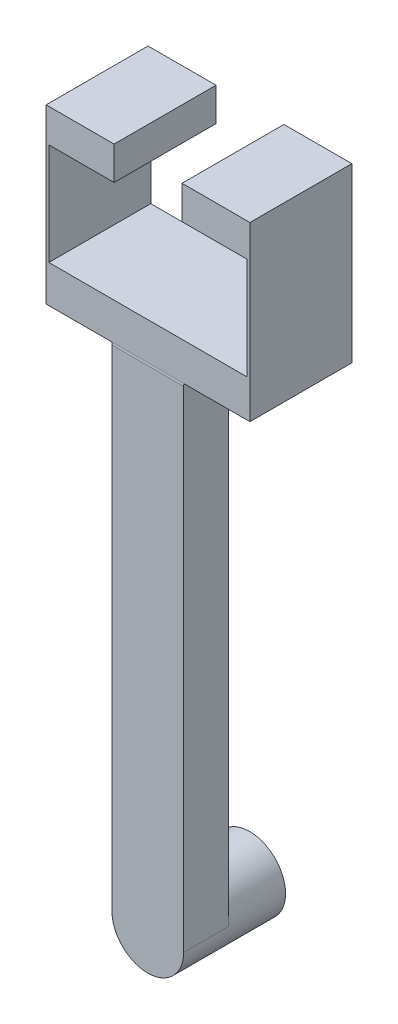
ISO-10303-21;
HEADER;
FILE_DESCRIPTION(('STEP AP214'),'2;1');
FILE_NAME('part.step','',(''),(''),'','','');
FILE_SCHEMA(('AUTOMOTIVE_DESIGN { 1 0 10303 214 1 1 1 1 }'));
ENDSEC;
DATA;
#1=APPLICATION_CONTEXT('core data for automotive mechanical design processes');
#2=APPLICATION_PROTOCOL_DEFINITION('international standard','automotive_design',2000,#1);
#3=PRODUCT_CONTEXT('',#1,'mechanical');
#4=PRODUCT('Part','Part','',(#3));
#5=PRODUCT_RELATED_PRODUCT_CATEGORY('part','',(#4));
#6=PRODUCT_DEFINITION_FORMATION('','',#4);
#7=PRODUCT_DEFINITION_CONTEXT('part definition',#1,'design');
#8=PRODUCT_DEFINITION('design','',#6,#7);
#9=PRODUCT_DEFINITION_SHAPE('','',#8);
#10=(LENGTH_UNIT() NAMED_UNIT(*) SI_UNIT(.MILLI.,.METRE.));
#11=(NAMED_UNIT(*) PLANE_ANGLE_UNIT() SI_UNIT($,.RADIAN.));
#12=(NAMED_UNIT(*) SI_UNIT($,.STERADIAN.) SOLID_ANGLE_UNIT());
#13=UNCERTAINTY_MEASURE_WITH_UNIT(LENGTH_MEASURE(1.E-05),#10,'distance_accuracy_value','');
#14=(GEOMETRIC_REPRESENTATION_CONTEXT(3) GLOBAL_UNCERTAINTY_ASSIGNED_CONTEXT((#13)) GLOBAL_UNIT_ASSIGNED_CONTEXT((#10,
#11,#12)) REPRESENTATION_CONTEXT('',''));
#15=CARTESIAN_POINT('',(0.,0.,0.));
#16=DIRECTION('',(0.,0.,1.));
#17=DIRECTION('',(1.,0.,0.));
#18=AXIS2_PLACEMENT_3D('',#15,#16,#17);
#19=CARTESIAN_POINT('',(0.,0.,38.1));
#20=DIRECTION('',(0.,0.,-1.));
#21=DIRECTION('',(-1.,0.,0.));
#22=AXIS2_PLACEMENT_3D('',#19,#20,#21);
#23=CYLINDRICAL_SURFACE('',#22,13.4112);
#24=CARTESIAN_POINT('',(0.,0.,38.1));
#25=DIRECTION('',(0.,0.,1.));
#26=DIRECTION('',(1.,0.,0.));
#27=AXIS2_PLACEMENT_3D('',#24,#25,#26);
#28=CIRCLE('',#27,13.4112);
#29=CARTESIAN_POINT('',(-13.4112,0.,38.1));
#30=VERTEX_POINT('',#29);
#31=CARTESIAN_POINT('',(13.4112,0.,38.1));
#32=VERTEX_POINT('',#31);
#33=EDGE_CURVE('E546',#30,#32,#28,.T.);
#34=ORIENTED_EDGE('',*,*,#33,.F.);
#35=DIRECTION('',(0.,0.,1.));
#36=VECTOR('',#35,1.);
#37=CARTESIAN_POINT('',(-13.4112,0.,21.3614));
#38=LINE('',#37,#36);
#39=CARTESIAN_POINT('',(-13.4112,0.,21.3614));
#40=VERTEX_POINT('',#39);
#41=EDGE_CURVE('E545',#40,#30,#38,.T.);
#42=ORIENTED_EDGE('',*,*,#41,.F.);
#43=CARTESIAN_POINT('',(0.,0.,21.3614));
#44=DIRECTION('',(0.,0.,-1.));
#45=DIRECTION('',(-1.,0.,0.));
#46=AXIS2_PLACEMENT_3D('',#43,#44,#45);
#47=CIRCLE('',#46,13.4112);
#48=CARTESIAN_POINT('',(13.4112,0.,21.3614));
#49=VERTEX_POINT('',#48);
#50=EDGE_CURVE('E549',#40,#49,#47,.T.);
#51=ORIENTED_EDGE('',*,*,#50,.T.);
#52=DIRECTION('',(0.,0.,1.));
#53=VECTOR('',#52,1.);
#54=CARTESIAN_POINT('',(13.4112,0.,21.3614));
#55=LINE('',#54,#53);
#56=EDGE_CURVE('E538',#49,#32,#55,.T.);
#57=ORIENTED_EDGE('',*,*,#56,.T.);
#58=EDGE_LOOP('',(#34,#42,#51,#57));
#59=FACE_BOUND('',#58,.T.);
#60=CARTESIAN_POINT('',(0.,0.,0.));
#61=DIRECTION('',(0.,0.,1.));
#62=DIRECTION('',(1.,0.,0.));
#63=AXIS2_PLACEMENT_3D('',#60,#61,#62);
#64=CIRCLE('',#63,13.4112);
#65=CARTESIAN_POINT('',(13.4112,0.,0.));
#66=VERTEX_POINT('',#65);
#67=EDGE_CURVE('E534',#66,#66,#64,.T.);
#68=ORIENTED_EDGE('',*,*,#67,.T.);
#69=EDGE_LOOP('',(#68));
#70=FACE_BOUND('',#69,.T.);
#71=ADVANCED_FACE('F254',(#59,#70),#23,.T.);
#72=CARTESIAN_POINT('',(0.,0.,38.1));
#73=DIRECTION('',(0.,0.,1.));
#74=DIRECTION('',(1.,0.,0.));
#75=AXIS2_PLACEMENT_3D('',#72,#73,#74);
#76=PLANE('',#75);
#77=DIRECTION('',(0.,1.,0.));
#78=VECTOR('',#77,1.);
#79=CARTESIAN_POINT('',(13.4112,0.,38.1));
#80=LINE('',#79,#78);
#81=CARTESIAN_POINT('',(13.4112,183.275219138852,38.1));
#82=VERTEX_POINT('',#81);
#83=EDGE_CURVE('E519',#32,#82,#80,.T.);
#84=ORIENTED_EDGE('',*,*,#83,.T.);
#85=DIRECTION('',(1.,0.,0.));
#86=VECTOR('',#85,1.);
#87=CARTESIAN_POINT('',(-13.4112,183.275219138852,38.1));
#88=LINE('',#87,#86);
#89=CARTESIAN_POINT('',(-13.4112,183.275219138852,38.1));
#90=VERTEX_POINT('',#89);
#91=EDGE_CURVE('E557',#82,#90,#88,.F.);
#92=ORIENTED_EDGE('',*,*,#91,.T.);
#93=DIRECTION('',(0.,-1.,0.));
#94=VECTOR('',#93,1.);
#95=CARTESIAN_POINT('',(-13.4112,0.,38.1));
#96=LINE('',#95,#94);
#97=EDGE_CURVE('E515',#90,#30,#96,.T.);
#98=ORIENTED_EDGE('',*,*,#97,.T.);
#99=ORIENTED_EDGE('',*,*,#33,.T.);
#100=EDGE_LOOP('',(#84,#92,#98,#99));
#101=FACE_BOUND('',#100,.T.);
#102=ADVANCED_FACE('F719',(#101),#76,.T.);
#103=CARTESIAN_POINT('',(0.,0.,0.));
#104=DIRECTION('',(0.,0.,1.));
#105=DIRECTION('',(1.,0.,0.));
#106=AXIS2_PLACEMENT_3D('',#103,#104,#105);
#107=PLANE('',#106);
#108=ORIENTED_EDGE('',*,*,#67,.F.);
#109=EDGE_LOOP('',(#108));
#110=FACE_BOUND('',#109,.T.);
#111=ADVANCED_FACE('F724',(#110),#107,.F.);
#112=CARTESIAN_POINT('',(-13.4112,0.,21.3614));
#113=DIRECTION('',(-1.,0.,0.));
#114=DIRECTION('',(0.,0.,1.));
#115=AXIS2_PLACEMENT_3D('',#112,#113,#114);
#116=PLANE('',#115);
#117=ORIENTED_EDGE('',*,*,#97,.F.);
#118=CARTESIAN_POINT('',(-13.4112,183.275219138852,34.29));
#119=DIRECTION('',(-1.,0.,0.));
#120=DIRECTION('',(0.,0.,1.));
#121=AXIS2_PLACEMENT_3D('',#118,#119,#120);
#122=CIRCLE('',#121,3.81);
#123=CARTESIAN_POINT('',(-13.4112,184.15,37.9982149944373));
#124=VERTEX_POINT('',#123);
#125=EDGE_CURVE('E262',#90,#124,#122,.T.);
#126=ORIENTED_EDGE('',*,*,#125,.T.);
#127=DIRECTION('',(0.,0.,1.));
#128=VECTOR('',#127,1.);
#129=CARTESIAN_POINT('',(-13.4112,184.15,21.3614));
#130=LINE('',#129,#128);
#131=CARTESIAN_POINT('',(-13.4112,184.15,21.3614));
#132=VERTEX_POINT('',#131);
#133=EDGE_CURVE('E530',#132,#124,#130,.T.);
#134=ORIENTED_EDGE('',*,*,#133,.F.);
#135=DIRECTION('',(0.,-1.,0.));
#136=VECTOR('',#135,1.);
#137=CARTESIAN_POINT('',(-13.4112,0.,21.3614));
#138=LINE('',#137,#136);
#139=EDGE_CURVE('E511',#132,#40,#138,.T.);
#140=ORIENTED_EDGE('',*,*,#139,.T.);
#141=ORIENTED_EDGE('',*,*,#41,.T.);
#142=EDGE_LOOP('',(#117,#126,#134,#140,#141));
#143=FACE_BOUND('',#142,.T.);
#144=ADVANCED_FACE('F565',(#143),#116,.T.);
#145=CARTESIAN_POINT('',(13.4112,0.,21.3614));
#146=DIRECTION('',(1.,0.,0.));
#147=DIRECTION('',(0.,0.,-1.));
#148=AXIS2_PLACEMENT_3D('',#145,#146,#147);
#149=PLANE('',#148);
#150=DIRECTION('',(0.,0.,1.));
#151=VECTOR('',#150,1.);
#152=CARTESIAN_POINT('',(13.4112,184.15,21.3614));
#153=LINE('',#152,#151);
#154=CARTESIAN_POINT('',(13.4112,184.15,21.3614));
#155=VERTEX_POINT('',#154);
#156=CARTESIAN_POINT('',(13.4112,184.15,37.9982149944373));
#157=VERTEX_POINT('',#156);
#158=EDGE_CURVE('E532',#155,#157,#153,.T.);
#159=ORIENTED_EDGE('',*,*,#158,.T.);
#160=CARTESIAN_POINT('',(13.4112,183.275219138852,34.29));
#161=DIRECTION('',(1.,0.,0.));
#162=DIRECTION('',(0.,0.,-1.));
#163=AXIS2_PLACEMENT_3D('',#160,#161,#162);
#164=CIRCLE('',#163,3.81);
#165=EDGE_CURVE('E13',#157,#82,#164,.T.);
#166=ORIENTED_EDGE('',*,*,#165,.T.);
#167=ORIENTED_EDGE('',*,*,#83,.F.);
#168=ORIENTED_EDGE('',*,*,#56,.F.);
#169=DIRECTION('',(0.,1.,0.));
#170=VECTOR('',#169,1.);
#171=CARTESIAN_POINT('',(13.4112,0.,21.3614));
#172=LINE('',#171,#170);
#173=EDGE_CURVE('E517',#49,#155,#172,.T.);
#174=ORIENTED_EDGE('',*,*,#173,.T.);
#175=EDGE_LOOP('',(#159,#166,#167,#168,#174));
#176=FACE_BOUND('',#175,.T.);
#177=ADVANCED_FACE('F734',(#176),#149,.T.);
#178=CARTESIAN_POINT('',(0.,0.,21.3614));
#179=DIRECTION('',(0.,0.,-1.));
#180=DIRECTION('',(-1.,0.,0.));
#181=AXIS2_PLACEMENT_3D('',#178,#179,#180);
#182=PLANE('',#181);
#183=ORIENTED_EDGE('',*,*,#50,.F.);
#184=ORIENTED_EDGE('',*,*,#139,.F.);
#185=DIRECTION('',(-1.,0.,0.));
#186=VECTOR('',#185,1.);
#187=CARTESIAN_POINT('',(-13.4112,184.15,21.3614));
#188=LINE('',#187,#186);
#189=EDGE_CURVE('E525',#155,#132,#188,.T.);
#190=ORIENTED_EDGE('',*,*,#189,.F.);
#191=ORIENTED_EDGE('',*,*,#173,.F.);
#192=EDGE_LOOP('',(#183,#184,#190,#191));
#193=FACE_BOUND('',#192,.T.);
#194=ADVANCED_FACE('F737',(#193),#182,.T.);
#195=CARTESIAN_POINT('',(38.1,198.12,-0.101785005562682));
#196=DIRECTION('',(-1.,0.,0.));
#197=DIRECTION('',(0.,0.,1.));
#198=AXIS2_PLACEMENT_3D('',#195,#196,#197);
#199=PLANE('',#198);
#200=DIRECTION('',(0.,0.,-1.));
#201=VECTOR('',#200,1.);
#202=CARTESIAN_POINT('',(38.1,184.15,-0.101785005562682));
#203=LINE('',#202,#201);
#204=CARTESIAN_POINT('',(38.1,184.15,37.9982149944373));
#205=VERTEX_POINT('',#204);
#206=CARTESIAN_POINT('',(38.1,184.15,-0.101785005562682));
#207=VERTEX_POINT('',#206);
#208=EDGE_CURVE('E470',#205,#207,#203,.T.);
#209=ORIENTED_EDGE('',*,*,#208,.T.);
#210=DIRECTION('',(0.,-1.,0.));
#211=VECTOR('',#210,1.);
#212=CARTESIAN_POINT('',(38.1,198.12,-0.101785005562682));
#213=LINE('',#212,#211);
#214=CARTESIAN_POINT('',(38.1,248.666,-0.101785005562682));
#215=VERTEX_POINT('',#214);
#216=EDGE_CURVE('E506',#215,#207,#213,.T.);
#217=ORIENTED_EDGE('',*,*,#216,.F.);
#218=DIRECTION('',(0.,0.,-1.));
#219=VECTOR('',#218,1.);
#220=CARTESIAN_POINT('',(38.1,248.666,-0.101785005562682));
#221=LINE('',#220,#219);
#222=CARTESIAN_POINT('',(38.1,248.666,37.9982149944373));
#223=VERTEX_POINT('',#222);
#224=EDGE_CURVE('E446',#223,#215,#221,.T.);
#225=ORIENTED_EDGE('',*,*,#224,.F.);
#226=DIRECTION('',(0.,-1.,0.));
#227=VECTOR('',#226,1.);
#228=CARTESIAN_POINT('',(38.1,198.12,37.9982149944373));
#229=LINE('',#228,#227);
#230=EDGE_CURVE('E387',#223,#205,#229,.T.);
#231=ORIENTED_EDGE('',*,*,#230,.T.);
#232=EDGE_LOOP('',(#209,#217,#225,#231));
#233=FACE_BOUND('',#232,.T.);
#234=ADVANCED_FACE('F579',(#233),#199,.F.);
#235=CARTESIAN_POINT('',(-38.1,198.12,-0.101785005562682));
#236=DIRECTION('',(0.,0.,1.));
#237=DIRECTION('',(1.,0.,0.));
#238=AXIS2_PLACEMENT_3D('',#235,#236,#237);
#239=PLANE('',#238);
#240=DIRECTION('',(-1.,0.,0.));
#241=VECTOR('',#240,1.);
#242=CARTESIAN_POINT('',(-38.1,184.15,-0.101785005562682));
#243=LINE('',#242,#241);
#244=CARTESIAN_POINT('',(-38.1,184.15,-0.101785005562682));
#245=VERTEX_POINT('',#244);
#246=EDGE_CURVE('E492',#207,#245,#243,.T.);
#247=ORIENTED_EDGE('',*,*,#246,.T.);
#248=DIRECTION('',(0.,-1.,0.));
#249=VECTOR('',#248,1.);
#250=CARTESIAN_POINT('',(-38.1,198.12,-0.101785005562682));
#251=LINE('',#250,#249);
#252=CARTESIAN_POINT('',(-38.1,248.666,-0.101785005562682));
#253=VERTEX_POINT('',#252);
#254=EDGE_CURVE('E384',#253,#245,#251,.T.);
#255=ORIENTED_EDGE('',*,*,#254,.F.);
#256=DIRECTION('',(-1.,0.,0.));
#257=VECTOR('',#256,1.);
#258=CARTESIAN_POINT('',(-38.1,248.666,-0.101785005562682));
#259=LINE('',#258,#257);
#260=CARTESIAN_POINT('',(-12.7,248.666,-0.101785005562682));
#261=VERTEX_POINT('',#260);
#262=EDGE_CURVE('E402',#261,#253,#259,.T.);
#263=ORIENTED_EDGE('',*,*,#262,.F.);
#264=DIRECTION('',(0.,-1.,0.));
#265=VECTOR('',#264,1.);
#266=CARTESIAN_POINT('',(-12.7,248.666,-0.101785005562682));
#267=LINE('',#266,#265);
#268=CARTESIAN_POINT('',(-12.7,236.22,-0.101785005562682));
#269=VERTEX_POINT('',#268);
#270=EDGE_CURVE('E664',#261,#269,#267,.T.);
#271=ORIENTED_EDGE('',*,*,#270,.T.);
#272=DIRECTION('',(-1.,0.,0.));
#273=VECTOR('',#272,1.);
#274=CARTESIAN_POINT('',(-38.1,236.22,-0.101785005562682));
#275=LINE('',#274,#273);
#276=CARTESIAN_POINT('',(-37.084,236.22,-0.101785005562682));
#277=VERTEX_POINT('',#276);
#278=EDGE_CURVE('E401',#269,#277,#275,.T.);
#279=ORIENTED_EDGE('',*,*,#278,.T.);
#280=DIRECTION('',(0.,-1.,0.));
#281=VECTOR('',#280,1.);
#282=CARTESIAN_POINT('',(-37.084,236.22,-0.101785005562682));
#283=LINE('',#282,#281);
#284=CARTESIAN_POINT('',(-37.084,198.12,-0.101785005562682));
#285=VERTEX_POINT('',#284);
#286=EDGE_CURVE('E454',#277,#285,#283,.T.);
#287=ORIENTED_EDGE('',*,*,#286,.T.);
#288=DIRECTION('',(-1.,0.,0.));
#289=VECTOR('',#288,1.);
#290=CARTESIAN_POINT('',(-38.1,198.12,-0.101785005562682));
#291=LINE('',#290,#289);
#292=CARTESIAN_POINT('',(37.084,198.12,-0.101785005562682));
#293=VERTEX_POINT('',#292);
#294=EDGE_CURVE('E483',#293,#285,#291,.T.);
#295=ORIENTED_EDGE('',*,*,#294,.F.);
#296=DIRECTION('',(0.,-1.,0.));
#297=VECTOR('',#296,1.);
#298=CARTESIAN_POINT('',(37.084,236.22,-0.101785005562682));
#299=LINE('',#298,#297);
#300=CARTESIAN_POINT('',(37.084,236.22,-0.101785005562682));
#301=VERTEX_POINT('',#300);
#302=EDGE_CURVE('E466',#301,#293,#299,.T.);
#303=ORIENTED_EDGE('',*,*,#302,.F.);
#304=DIRECTION('',(-1.,0.,0.));
#305=VECTOR('',#304,1.);
#306=CARTESIAN_POINT('',(38.1,236.22,-0.101785005562682));
#307=LINE('',#306,#305);
#308=CARTESIAN_POINT('',(12.7,236.22,-0.101785005562679));
#309=VERTEX_POINT('',#308);
#310=EDGE_CURVE('E428',#301,#309,#307,.T.);
#311=ORIENTED_EDGE('',*,*,#310,.T.);
#312=DIRECTION('',(0.,-1.,0.));
#313=VECTOR('',#312,1.);
#314=CARTESIAN_POINT('',(12.7,248.666,-0.101785005562679));
#315=LINE('',#314,#313);
#316=CARTESIAN_POINT('',(12.7,248.666,-0.101785005562679));
#317=VERTEX_POINT('',#316);
#318=EDGE_CURVE('E584',#317,#309,#315,.T.);
#319=ORIENTED_EDGE('',*,*,#318,.F.);
#320=DIRECTION('',(-1.,0.,0.));
#321=VECTOR('',#320,1.);
#322=CARTESIAN_POINT('',(38.1,248.666,-0.101785005562682));
#323=LINE('',#322,#321);
#324=EDGE_CURVE('E444',#215,#317,#323,.T.);
#325=ORIENTED_EDGE('',*,*,#324,.F.);
#326=ORIENTED_EDGE('',*,*,#216,.T.);
#327=EDGE_LOOP('',(#247,#255,#263,#271,#279,#287,#295,#303,#311,#319,#325,#326));
#328=FACE_BOUND('',#327,.T.);
#329=ADVANCED_FACE('F582',(#328),#239,.F.);
#330=CARTESIAN_POINT('',(-38.1,198.12,-0.101785005562682));
#331=DIRECTION('',(1.,0.,0.));
#332=DIRECTION('',(0.,0.,-1.));
#333=AXIS2_PLACEMENT_3D('',#330,#331,#332);
#334=PLANE('',#333);
#335=DIRECTION('',(0.,0.,1.));
#336=VECTOR('',#335,1.);
#337=CARTESIAN_POINT('',(-38.1,184.15,-0.101785005562682));
#338=LINE('',#337,#336);
#339=CARTESIAN_POINT('',(-38.1,184.15,37.9982149944373));
#340=VERTEX_POINT('',#339);
#341=EDGE_CURVE('E379',#245,#340,#338,.T.);
#342=ORIENTED_EDGE('',*,*,#341,.T.);
#343=DIRECTION('',(0.,-1.,0.));
#344=VECTOR('',#343,1.);
#345=CARTESIAN_POINT('',(-38.1,198.12,37.9982149944373));
#346=LINE('',#345,#344);
#347=CARTESIAN_POINT('',(-38.1,248.666,37.9982149944373));
#348=VERTEX_POINT('',#347);
#349=EDGE_CURVE('E373',#348,#340,#346,.T.);
#350=ORIENTED_EDGE('',*,*,#349,.F.);
#351=DIRECTION('',(0.,0.,1.));
#352=VECTOR('',#351,1.);
#353=CARTESIAN_POINT('',(-38.1,248.666,-0.101785005562682));
#354=LINE('',#353,#352);
#355=EDGE_CURVE('E378',#253,#348,#354,.T.);
#356=ORIENTED_EDGE('',*,*,#355,.F.);
#357=ORIENTED_EDGE('',*,*,#254,.T.);
#358=EDGE_LOOP('',(#342,#350,#356,#357));
#359=FACE_BOUND('',#358,.T.);
#360=ADVANCED_FACE('F374',(#359),#334,.F.);
#361=CARTESIAN_POINT('',(-38.1,198.12,37.9982149944373));
#362=DIRECTION('',(0.,0.,-1.));
#363=DIRECTION('',(-1.,0.,0.));
#364=AXIS2_PLACEMENT_3D('',#361,#362,#363);
#365=PLANE('',#364);
#366=DIRECTION('',(1.,0.,0.));
#367=VECTOR('',#366,1.);
#368=CARTESIAN_POINT('',(-38.1,184.15,37.9982149944373));
#369=LINE('',#368,#367);
#370=EDGE_CURVE('E486',#340,#124,#369,.T.);
#371=ORIENTED_EDGE('',*,*,#370,.T.);
#372=EDGE_CURVE('E502',#124,#157,#369,.T.);
#373=ORIENTED_EDGE('',*,*,#372,.T.);
#374=EDGE_CURVE('E496',#157,#205,#369,.T.);
#375=ORIENTED_EDGE('',*,*,#374,.T.);
#376=ORIENTED_EDGE('',*,*,#230,.F.);
#377=DIRECTION('',(1.,0.,0.));
#378=VECTOR('',#377,1.);
#379=CARTESIAN_POINT('',(38.1,248.666,37.9982149944373));
#380=LINE('',#379,#378);
#381=CARTESIAN_POINT('',(12.7,248.666,37.9982149944373));
#382=VERTEX_POINT('',#381);
#383=EDGE_CURVE('E434',#382,#223,#380,.T.);
#384=ORIENTED_EDGE('',*,*,#383,.F.);
#385=DIRECTION('',(0.,-1.,0.));
#386=VECTOR('',#385,1.);
#387=CARTESIAN_POINT('',(12.7,248.666,37.9982149944373));
#388=LINE('',#387,#386);
#389=CARTESIAN_POINT('',(12.7,236.22,37.9982149944373));
#390=VERTEX_POINT('',#389);
#391=EDGE_CURVE('E439',#382,#390,#388,.T.);
#392=ORIENTED_EDGE('',*,*,#391,.T.);
#393=DIRECTION('',(1.,0.,0.));
#394=VECTOR('',#393,1.);
#395=CARTESIAN_POINT('',(38.1,236.22,37.9982149944373));
#396=LINE('',#395,#394);
#397=CARTESIAN_POINT('',(37.084,236.22,37.9982149944373));
#398=VERTEX_POINT('',#397);
#399=EDGE_CURVE('E427',#390,#398,#396,.T.);
#400=ORIENTED_EDGE('',*,*,#399,.T.);
#401=DIRECTION('',(0.,-1.,0.));
#402=VECTOR('',#401,1.);
#403=CARTESIAN_POINT('',(37.084,236.22,37.9982149944373));
#404=LINE('',#403,#402);
#405=CARTESIAN_POINT('',(37.084,198.12,37.9982149944373));
#406=VERTEX_POINT('',#405);
#407=EDGE_CURVE('E472',#398,#406,#404,.T.);
#408=ORIENTED_EDGE('',*,*,#407,.T.);
#409=DIRECTION('',(1.,0.,0.));
#410=VECTOR('',#409,1.);
#411=CARTESIAN_POINT('',(-38.1,198.12,37.9982149944373));
#412=LINE('',#411,#410);
#413=CARTESIAN_POINT('',(-37.084,198.12,37.9982149944373));
#414=VERTEX_POINT('',#413);
#415=EDGE_CURVE('E484',#414,#406,#412,.T.);
#416=ORIENTED_EDGE('',*,*,#415,.F.);
#417=DIRECTION('',(0.,-1.,0.));
#418=VECTOR('',#417,1.);
#419=CARTESIAN_POINT('',(-37.084,236.22,37.9982149944373));
#420=LINE('',#419,#418);
#421=CARTESIAN_POINT('',(-37.084,236.22,37.9982149944373));
#422=VERTEX_POINT('',#421);
#423=EDGE_CURVE('E464',#422,#414,#420,.T.);
#424=ORIENTED_EDGE('',*,*,#423,.F.);
#425=DIRECTION('',(1.,0.,0.));
#426=VECTOR('',#425,1.);
#427=CARTESIAN_POINT('',(-38.1,236.22,37.9982149944373));
#428=LINE('',#427,#426);
#429=CARTESIAN_POINT('',(-12.7,236.22,37.9982149944373));
#430=VERTEX_POINT('',#429);
#431=EDGE_CURVE('E432',#422,#430,#428,.T.);
#432=ORIENTED_EDGE('',*,*,#431,.T.);
#433=DIRECTION('',(0.,-1.,0.));
#434=VECTOR('',#433,1.);
#435=CARTESIAN_POINT('',(-12.7,248.666,37.9982149944373));
#436=LINE('',#435,#434);
#437=CARTESIAN_POINT('',(-12.7,248.666,37.9982149944373));
#438=VERTEX_POINT('',#437);
#439=EDGE_CURVE('E392',#438,#430,#436,.T.);
#440=ORIENTED_EDGE('',*,*,#439,.F.);
#441=DIRECTION('',(1.,0.,0.));
#442=VECTOR('',#441,1.);
#443=CARTESIAN_POINT('',(-38.1,248.666,37.9982149944373));
#444=LINE('',#443,#442);
#445=EDGE_CURVE('E386',#348,#438,#444,.T.);
#446=ORIENTED_EDGE('',*,*,#445,.F.);
#447=ORIENTED_EDGE('',*,*,#349,.T.);
#448=EDGE_LOOP('',(#371,#373,#375,#376,#384,#392,#400,#408,#416,#424,#432,#440,#446,#447));
#449=FACE_BOUND('',#448,.T.);
#450=ADVANCED_FACE('F388',(#449),#365,.F.);
#451=CARTESIAN_POINT('',(0.,198.12,0.));
#452=DIRECTION('',(0.,1.,0.));
#453=DIRECTION('',(0.,0.,1.));
#454=AXIS2_PLACEMENT_3D('',#451,#452,#453);
#455=PLANE('',#454);
#456=DIRECTION('',(0.,0.,-1.));
#457=VECTOR('',#456,1.);
#458=CARTESIAN_POINT('',(-37.084,198.12,-0.101785005562682));
#459=LINE('',#458,#457);
#460=EDGE_CURVE('E452',#414,#285,#459,.T.);
#461=ORIENTED_EDGE('',*,*,#460,.F.);
#462=ORIENTED_EDGE('',*,*,#415,.T.);
#463=DIRECTION('',(0.,0.,1.));
#464=VECTOR('',#463,1.);
#465=CARTESIAN_POINT('',(37.084,198.12,-0.101785005562682));
#466=LINE('',#465,#464);
#467=EDGE_CURVE('E459',#293,#406,#466,.T.);
#468=ORIENTED_EDGE('',*,*,#467,.F.);
#469=ORIENTED_EDGE('',*,*,#294,.T.);
#470=EDGE_LOOP('',(#461,#462,#468,#469));
#471=FACE_BOUND('',#470,.T.);
#472=ADVANCED_FACE('F703',(#471),#455,.T.);
#473=CARTESIAN_POINT('',(0.,184.15,0.));
#474=DIRECTION('',(0.,1.,0.));
#475=DIRECTION('',(0.,0.,1.));
#476=AXIS2_PLACEMENT_3D('',#473,#474,#475);
#477=PLANE('',#476);
#478=ORIENTED_EDGE('',*,*,#158,.F.);
#479=ORIENTED_EDGE('',*,*,#189,.T.);
#480=ORIENTED_EDGE('',*,*,#133,.T.);
#481=ORIENTED_EDGE('',*,*,#370,.F.);
#482=ORIENTED_EDGE('',*,*,#341,.F.);
#483=ORIENTED_EDGE('',*,*,#246,.F.);
#484=ORIENTED_EDGE('',*,*,#208,.F.);
#485=ORIENTED_EDGE('',*,*,#374,.F.);
#486=EDGE_LOOP('',(#478,#479,#480,#481,#482,#483,#484,#485));
#487=FACE_BOUND('',#486,.T.);
#488=ADVANCED_FACE('F570',(#487),#477,.F.);
#489=CARTESIAN_POINT('',(37.084,236.22,-0.101785005562682));
#490=DIRECTION('',(1.,0.,0.));
#491=DIRECTION('',(0.,0.,-1.));
#492=AXIS2_PLACEMENT_3D('',#489,#490,#491);
#493=PLANE('',#492);
#494=ORIENTED_EDGE('',*,*,#467,.T.);
#495=ORIENTED_EDGE('',*,*,#407,.F.);
#496=DIRECTION('',(0.,0.,1.));
#497=VECTOR('',#496,1.);
#498=CARTESIAN_POINT('',(37.084,236.22,-0.101785005562682));
#499=LINE('',#498,#497);
#500=EDGE_CURVE('E478',#301,#398,#499,.T.);
#501=ORIENTED_EDGE('',*,*,#500,.F.);
#502=ORIENTED_EDGE('',*,*,#302,.T.);
#503=EDGE_LOOP('',(#494,#495,#501,#502));
#504=FACE_BOUND('',#503,.T.);
#505=ADVANCED_FACE('F704',(#504),#493,.F.);
#506=CARTESIAN_POINT('',(-37.084,236.22,-0.101785005562682));
#507=DIRECTION('',(-1.,0.,0.));
#508=DIRECTION('',(0.,0.,1.));
#509=AXIS2_PLACEMENT_3D('',#506,#507,#508);
#510=PLANE('',#509);
#511=ORIENTED_EDGE('',*,*,#460,.T.);
#512=ORIENTED_EDGE('',*,*,#286,.F.);
#513=DIRECTION('',(0.,0.,-1.));
#514=VECTOR('',#513,1.);
#515=CARTESIAN_POINT('',(-37.084,236.22,-0.101785005562682));
#516=LINE('',#515,#514);
#517=EDGE_CURVE('E448',#422,#277,#516,.T.);
#518=ORIENTED_EDGE('',*,*,#517,.F.);
#519=ORIENTED_EDGE('',*,*,#423,.T.);
#520=EDGE_LOOP('',(#511,#512,#518,#519));
#521=FACE_BOUND('',#520,.T.);
#522=ADVANCED_FACE('F701',(#521),#510,.F.);
#523=CARTESIAN_POINT('',(0.,236.22,0.));
#524=DIRECTION('',(0.,1.,0.));
#525=DIRECTION('',(0.,0.,1.));
#526=AXIS2_PLACEMENT_3D('',#523,#524,#525);
#527=PLANE('',#526);
#528=ORIENTED_EDGE('',*,*,#431,.F.);
#529=ORIENTED_EDGE('',*,*,#517,.T.);
#530=ORIENTED_EDGE('',*,*,#278,.F.);
#531=DIRECTION('',(0.,0.,-1.));
#532=VECTOR('',#531,1.);
#533=CARTESIAN_POINT('',(-12.7,236.22,-0.101785005562682));
#534=LINE('',#533,#532);
#535=EDGE_CURVE('E409',#430,#269,#534,.T.);
#536=ORIENTED_EDGE('',*,*,#535,.F.);
#537=EDGE_LOOP('',(#528,#529,#530,#536));
#538=FACE_BOUND('',#537,.T.);
#539=ADVANCED_FACE('F696',(#538),#527,.F.);
#540=CARTESIAN_POINT('',(-12.7,248.666,-0.101785005562682));
#541=DIRECTION('',(-1.,0.,0.));
#542=DIRECTION('',(0.,0.,1.));
#543=AXIS2_PLACEMENT_3D('',#540,#541,#542);
#544=PLANE('',#543);
#545=ORIENTED_EDGE('',*,*,#535,.T.);
#546=ORIENTED_EDGE('',*,*,#270,.F.);
#547=DIRECTION('',(0.,0.,-1.));
#548=VECTOR('',#547,1.);
#549=CARTESIAN_POINT('',(-12.7,248.666,-0.101785005562682));
#550=LINE('',#549,#548);
#551=EDGE_CURVE('E398',#438,#261,#550,.T.);
#552=ORIENTED_EDGE('',*,*,#551,.F.);
#553=ORIENTED_EDGE('',*,*,#439,.T.);
#554=EDGE_LOOP('',(#545,#546,#552,#553));
#555=FACE_BOUND('',#554,.T.);
#556=ADVANCED_FACE('F694',(#555),#544,.F.);
#557=CARTESIAN_POINT('',(0.,248.666,0.));
#558=DIRECTION('',(0.,1.,0.));
#559=DIRECTION('',(0.,0.,1.));
#560=AXIS2_PLACEMENT_3D('',#557,#558,#559);
#561=PLANE('',#560);
#562=ORIENTED_EDGE('',*,*,#355,.T.);
#563=ORIENTED_EDGE('',*,*,#445,.T.);
#564=ORIENTED_EDGE('',*,*,#551,.T.);
#565=ORIENTED_EDGE('',*,*,#262,.T.);
#566=EDGE_LOOP('',(#562,#563,#564,#565));
#567=FACE_BOUND('',#566,.T.);
#568=ADVANCED_FACE('F399',(#567),#561,.T.);
#569=CARTESIAN_POINT('',(12.7,248.666,-0.101785005562679));
#570=DIRECTION('',(1.,0.,0.));
#571=DIRECTION('',(0.,0.,-1.));
#572=AXIS2_PLACEMENT_3D('',#569,#570,#571);
#573=PLANE('',#572);
#574=DIRECTION('',(0.,0.,1.));
#575=VECTOR('',#574,1.);
#576=CARTESIAN_POINT('',(12.7,236.22,-0.101785005562679));
#577=LINE('',#576,#575);
#578=EDGE_CURVE('E421',#309,#390,#577,.T.);
#579=ORIENTED_EDGE('',*,*,#578,.T.);
#580=ORIENTED_EDGE('',*,*,#391,.F.);
#581=DIRECTION('',(0.,0.,1.));
#582=VECTOR('',#581,1.);
#583=CARTESIAN_POINT('',(12.7,248.666,-0.101785005562679));
#584=LINE('',#583,#582);
#585=EDGE_CURVE('E438',#317,#382,#584,.T.);
#586=ORIENTED_EDGE('',*,*,#585,.F.);
#587=ORIENTED_EDGE('',*,*,#318,.T.);
#588=EDGE_LOOP('',(#579,#580,#586,#587));
#589=FACE_BOUND('',#588,.T.);
#590=ADVANCED_FACE('F706',(#589),#573,.F.);
#591=CARTESIAN_POINT('',(0.,248.666,0.));
#592=DIRECTION('',(0.,-1.,0.));
#593=DIRECTION('',(0.,0.,-1.));
#594=AXIS2_PLACEMENT_3D('',#591,#592,#593);
#595=PLANE('',#594);
#596=ORIENTED_EDGE('',*,*,#224,.T.);
#597=ORIENTED_EDGE('',*,*,#324,.T.);
#598=ORIENTED_EDGE('',*,*,#585,.T.);
#599=ORIENTED_EDGE('',*,*,#383,.T.);
#600=EDGE_LOOP('',(#596,#597,#598,#599));
#601=FACE_BOUND('',#600,.T.);
#602=ADVANCED_FACE('F586',(#601),#595,.F.);
#603=CARTESIAN_POINT('',(0.,236.22,0.));
#604=DIRECTION('',(0.,-1.,0.));
#605=DIRECTION('',(0.,0.,-1.));
#606=AXIS2_PLACEMENT_3D('',#603,#604,#605);
#607=PLANE('',#606);
#608=ORIENTED_EDGE('',*,*,#310,.F.);
#609=ORIENTED_EDGE('',*,*,#500,.T.);
#610=ORIENTED_EDGE('',*,*,#399,.F.);
#611=ORIENTED_EDGE('',*,*,#578,.F.);
#612=EDGE_LOOP('',(#608,#609,#610,#611));
#613=FACE_BOUND('',#612,.T.);
#614=ADVANCED_FACE('F598',(#613),#607,.T.);
#615=CARTESIAN_POINT('',(-13.4112,183.275219138852,34.29));
#616=DIRECTION('',(-1.,0.,0.));
#617=DIRECTION('',(0.,0.,1.));
#618=AXIS2_PLACEMENT_3D('',#615,#616,#617);
#619=CYLINDRICAL_SURFACE('',#618,3.81);
#620=ORIENTED_EDGE('',*,*,#165,.F.);
#621=ORIENTED_EDGE('',*,*,#372,.F.);
#622=ORIENTED_EDGE('',*,*,#125,.F.);
#623=ORIENTED_EDGE('',*,*,#91,.F.);
#624=EDGE_LOOP('',(#620,#621,#622,#623));
#625=FACE_BOUND('',#624,.T.);
#626=ADVANCED_FACE('F260',(#625),#619,.T.);
#627=CLOSED_SHELL('',(#71,#102,#111,#144,#177,#194,#234,#329,#360,#450,#472,#488,#505,#522,#539,
#556,#568,#590,#602,#614,#626));
#628=MANIFOLD_SOLID_BREP('B2',#627);
#629=ADVANCED_BREP_SHAPE_REPRESENTATION('',(#18,#628),#14);
#630=SHAPE_DEFINITION_REPRESENTATION(#9,#629);
ENDSEC;
END-ISO-10303-21;
